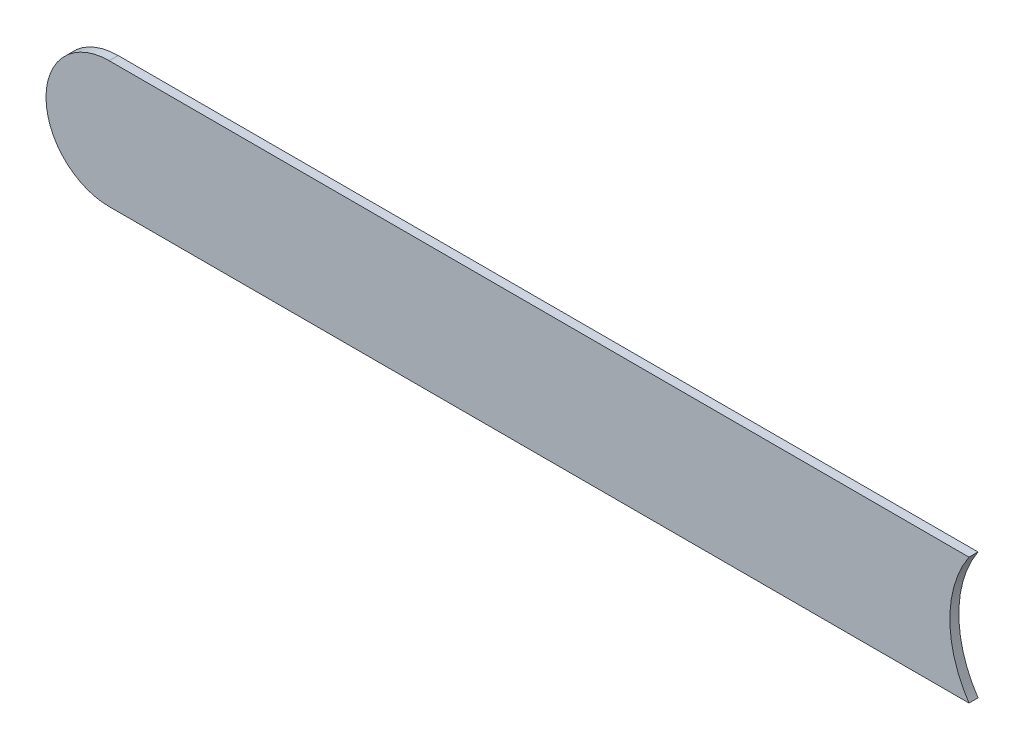
ISO-10303-21;
HEADER;
FILE_DESCRIPTION(('STEP AP214'),'2;1');
FILE_NAME('part.step','',(''),(''),'','','');
FILE_SCHEMA(('AUTOMOTIVE_DESIGN { 1 0 10303 214 1 1 1 1 }'));
ENDSEC;
DATA;
#1=APPLICATION_CONTEXT('core data for automotive mechanical design processes');
#2=APPLICATION_PROTOCOL_DEFINITION('international standard','automotive_design',2000,#1);
#3=PRODUCT_CONTEXT('',#1,'mechanical');
#4=PRODUCT('Part','Part','',(#3));
#5=PRODUCT_RELATED_PRODUCT_CATEGORY('part','',(#4));
#6=PRODUCT_DEFINITION_FORMATION('','',#4);
#7=PRODUCT_DEFINITION_CONTEXT('part definition',#1,'design');
#8=PRODUCT_DEFINITION('design','',#6,#7);
#9=PRODUCT_DEFINITION_SHAPE('','',#8);
#10=(LENGTH_UNIT() NAMED_UNIT(*) SI_UNIT(.MILLI.,.METRE.));
#11=(NAMED_UNIT(*) PLANE_ANGLE_UNIT() SI_UNIT($,.RADIAN.));
#12=(NAMED_UNIT(*) SI_UNIT($,.STERADIAN.) SOLID_ANGLE_UNIT());
#13=UNCERTAINTY_MEASURE_WITH_UNIT(LENGTH_MEASURE(1.E-05),#10,'distance_accuracy_value','');
#14=(GEOMETRIC_REPRESENTATION_CONTEXT(3) GLOBAL_UNCERTAINTY_ASSIGNED_CONTEXT((#13)) GLOBAL_UNIT_ASSIGNED_CONTEXT((#10,
#11,#12)) REPRESENTATION_CONTEXT('',''));
#15=CARTESIAN_POINT('',(0.,0.,0.));
#16=DIRECTION('',(0.,0.,1.));
#17=DIRECTION('',(1.,0.,0.));
#18=AXIS2_PLACEMENT_3D('',#15,#16,#17);
#19=CARTESIAN_POINT('',(39.6839948,73.3500057,0.));
#20=DIRECTION('',(0.,1.,0.));
#21=DIRECTION('',(1.,0.,0.));
#22=AXIS2_PLACEMENT_3D('',#19,#20,#21);
#23=PLANE('',#22);
#24=DIRECTION('',(1.,0.,0.));
#25=VECTOR('',#24,1.);
#26=CARTESIAN_POINT('',(39.6839948,73.3500057,0.03556));
#27=LINE('',#26,#25);
#28=CARTESIAN_POINT('',(39.6839948,73.3500057,0.03556));
#29=VERTEX_POINT('',#28);
#30=CARTESIAN_POINT('',(43.0858446096541,73.3500057,0.03556));
#31=VERTEX_POINT('',#30);
#32=EDGE_CURVE('E11',#29,#31,#27,.T.);
#33=ORIENTED_EDGE('',*,*,#32,.F.);
#34=DIRECTION('',(0.,0.,1.));
#35=VECTOR('',#34,1.);
#36=CARTESIAN_POINT('',(39.6839948,73.3500057,0.));
#37=LINE('',#36,#35);
#38=CARTESIAN_POINT('',(39.6839948,73.3500057,0.));
#39=VERTEX_POINT('',#38);
#40=EDGE_CURVE('E24',#39,#29,#37,.T.);
#41=ORIENTED_EDGE('',*,*,#40,.F.);
#42=DIRECTION('',(1.,0.,0.));
#43=VECTOR('',#42,1.);
#44=CARTESIAN_POINT('',(39.6839948,73.3500057,0.));
#45=LINE('',#44,#43);
#46=CARTESIAN_POINT('',(43.0858446096541,73.3500057,0.));
#47=VERTEX_POINT('',#46);
#48=EDGE_CURVE('E75',#39,#47,#45,.T.);
#49=ORIENTED_EDGE('',*,*,#48,.T.);
#50=DIRECTION('',(0.,0.,1.));
#51=VECTOR('',#50,1.);
#52=CARTESIAN_POINT('',(43.0858446096541,73.3500057,0.));
#53=LINE('',#52,#51);
#54=EDGE_CURVE('E37',#47,#31,#53,.T.);
#55=ORIENTED_EDGE('',*,*,#54,.T.);
#56=EDGE_LOOP('',(#33,#41,#49,#55));
#57=FACE_BOUND('',#56,.T.);
#58=ADVANCED_FACE('F17',(#57),#23,.F.);
#59=CARTESIAN_POINT('',(43.4600096,73.6000052,0.));
#60=DIRECTION('',(0.,0.,-1.));
#61=DIRECTION('',(1.,0.,0.));
#62=AXIS2_PLACEMENT_3D('',#59,#60,#61);
#63=CYLINDRICAL_SURFACE('',#62,0.4499991);
#64=DIRECTION('',(0.,0.,1.));
#65=VECTOR('',#64,1.);
#66=CARTESIAN_POINT('',(43.0858446096541,73.8500047,0.));
#67=LINE('',#66,#65);
#68=CARTESIAN_POINT('',(43.0858446096541,73.8500047,0.));
#69=VERTEX_POINT('',#68);
#70=CARTESIAN_POINT('',(43.0858446096541,73.8500047,0.03556));
#71=VERTEX_POINT('',#70);
#72=EDGE_CURVE('E67',#69,#71,#67,.T.);
#73=ORIENTED_EDGE('',*,*,#72,.T.);
#74=CARTESIAN_POINT('',(43.4600096,73.6000052,0.03556));
#75=DIRECTION('',(0.,0.,1.));
#76=DIRECTION('',(1.,0.,0.));
#77=AXIS2_PLACEMENT_3D('',#74,#75,#76);
#78=CIRCLE('',#77,0.4499991);
#79=EDGE_CURVE('E82',#71,#31,#78,.T.);
#80=ORIENTED_EDGE('',*,*,#79,.T.);
#81=ORIENTED_EDGE('',*,*,#54,.F.);
#82=CARTESIAN_POINT('',(43.4600096,73.6000052,0.));
#83=DIRECTION('',(0.,0.,1.));
#84=DIRECTION('',(1.,0.,0.));
#85=AXIS2_PLACEMENT_3D('',#82,#83,#84);
#86=CIRCLE('',#85,0.4499991);
#87=EDGE_CURVE('E80',#69,#47,#86,.T.);
#88=ORIENTED_EDGE('',*,*,#87,.F.);
#89=EDGE_LOOP('',(#73,#80,#81,#88));
#90=FACE_BOUND('',#89,.T.);
#91=ADVANCED_FACE('F88',(#90),#63,.F.);
#92=CARTESIAN_POINT('',(43.0858446096541,73.8500047,0.));
#93=DIRECTION('',(0.,-1.,0.));
#94=DIRECTION('',(-1.,0.,0.));
#95=AXIS2_PLACEMENT_3D('',#92,#93,#94);
#96=PLANE('',#95);
#97=DIRECTION('',(-1.,0.,0.));
#98=VECTOR('',#97,1.);
#99=CARTESIAN_POINT('',(43.4600096,73.8500047,0.03556));
#100=LINE('',#99,#98);
#101=CARTESIAN_POINT('',(39.6839948,73.8500047,0.03556));
#102=VERTEX_POINT('',#101);
#103=EDGE_CURVE('E71',#71,#102,#100,.T.);
#104=ORIENTED_EDGE('',*,*,#103,.F.);
#105=ORIENTED_EDGE('',*,*,#72,.F.);
#106=DIRECTION('',(-1.,0.,0.));
#107=VECTOR('',#106,1.);
#108=CARTESIAN_POINT('',(43.4600096,73.8500047,0.));
#109=LINE('',#108,#107);
#110=CARTESIAN_POINT('',(39.6839948,73.8500047,0.));
#111=VERTEX_POINT('',#110);
#112=EDGE_CURVE('E63',#69,#111,#109,.T.);
#113=ORIENTED_EDGE('',*,*,#112,.T.);
#114=DIRECTION('',(0.,0.,1.));
#115=VECTOR('',#114,1.);
#116=CARTESIAN_POINT('',(39.6839948,73.8500047,0.));
#117=LINE('',#116,#115);
#118=EDGE_CURVE('E53',#111,#102,#117,.T.);
#119=ORIENTED_EDGE('',*,*,#118,.T.);
#120=EDGE_LOOP('',(#104,#105,#113,#119));
#121=FACE_BOUND('',#120,.T.);
#122=ADVANCED_FACE('F66',(#121),#96,.F.);
#123=CARTESIAN_POINT('',(39.6839948,73.6000052,0.));
#124=DIRECTION('',(0.,0.,-1.));
#125=DIRECTION('',(0.,1.,0.));
#126=AXIS2_PLACEMENT_3D('',#123,#124,#125);
#127=CYLINDRICAL_SURFACE('',#126,0.249999500000001);
#128=CARTESIAN_POINT('',(39.6839948,73.6000052,0.03556));
#129=DIRECTION('',(0.,0.,1.));
#130=DIRECTION('',(0.,1.,0.));
#131=AXIS2_PLACEMENT_3D('',#128,#129,#130);
#132=CIRCLE('',#131,0.249999500000001);
#133=EDGE_CURVE('E59',#102,#29,#132,.T.);
#134=ORIENTED_EDGE('',*,*,#133,.F.);
#135=ORIENTED_EDGE('',*,*,#118,.F.);
#136=CARTESIAN_POINT('',(39.6839948,73.6000052,0.));
#137=DIRECTION('',(0.,0.,1.));
#138=DIRECTION('',(0.,1.,0.));
#139=AXIS2_PLACEMENT_3D('',#136,#137,#138);
#140=CIRCLE('',#139,0.249999500000001);
#141=EDGE_CURVE('E57',#111,#39,#140,.T.);
#142=ORIENTED_EDGE('',*,*,#141,.T.);
#143=ORIENTED_EDGE('',*,*,#40,.T.);
#144=EDGE_LOOP('',(#134,#135,#142,#143));
#145=FACE_BOUND('',#144,.T.);
#146=ADVANCED_FACE('F55',(#145),#127,.T.);
#147=CARTESIAN_POINT('',(39.6839948,73.3500057,0.));
#148=DIRECTION('',(0.,0.,-1.));
#149=DIRECTION('',(-1.,0.,0.));
#150=AXIS2_PLACEMENT_3D('',#147,#148,#149);
#151=PLANE('',#150);
#152=ORIENTED_EDGE('',*,*,#48,.F.);
#153=ORIENTED_EDGE('',*,*,#141,.F.);
#154=ORIENTED_EDGE('',*,*,#112,.F.);
#155=ORIENTED_EDGE('',*,*,#87,.T.);
#156=EDGE_LOOP('',(#152,#153,#154,#155));
#157=FACE_BOUND('',#156,.T.);
#158=ADVANCED_FACE('F74',(#157),#151,.T.);
#159=CARTESIAN_POINT('',(39.6839948,73.3500057,0.03556));
#160=DIRECTION('',(0.,0.,-1.));
#161=DIRECTION('',(-1.,0.,0.));
#162=AXIS2_PLACEMENT_3D('',#159,#160,#161);
#163=PLANE('',#162);
#164=ORIENTED_EDGE('',*,*,#133,.T.);
#165=ORIENTED_EDGE('',*,*,#32,.T.);
#166=ORIENTED_EDGE('',*,*,#79,.F.);
#167=ORIENTED_EDGE('',*,*,#103,.T.);
#168=EDGE_LOOP('',(#164,#165,#166,#167));
#169=FACE_BOUND('',#168,.T.);
#170=ADVANCED_FACE('F91',(#169),#163,.F.);
#171=CLOSED_SHELL('',(#58,#91,#122,#146,#158,#170));
#172=MANIFOLD_SOLID_BREP('B1',#171);
#173=ADVANCED_BREP_SHAPE_REPRESENTATION('',(#18,#172),#14);
#174=SHAPE_DEFINITION_REPRESENTATION(#9,#173);
ENDSEC;
END-ISO-10303-21;
